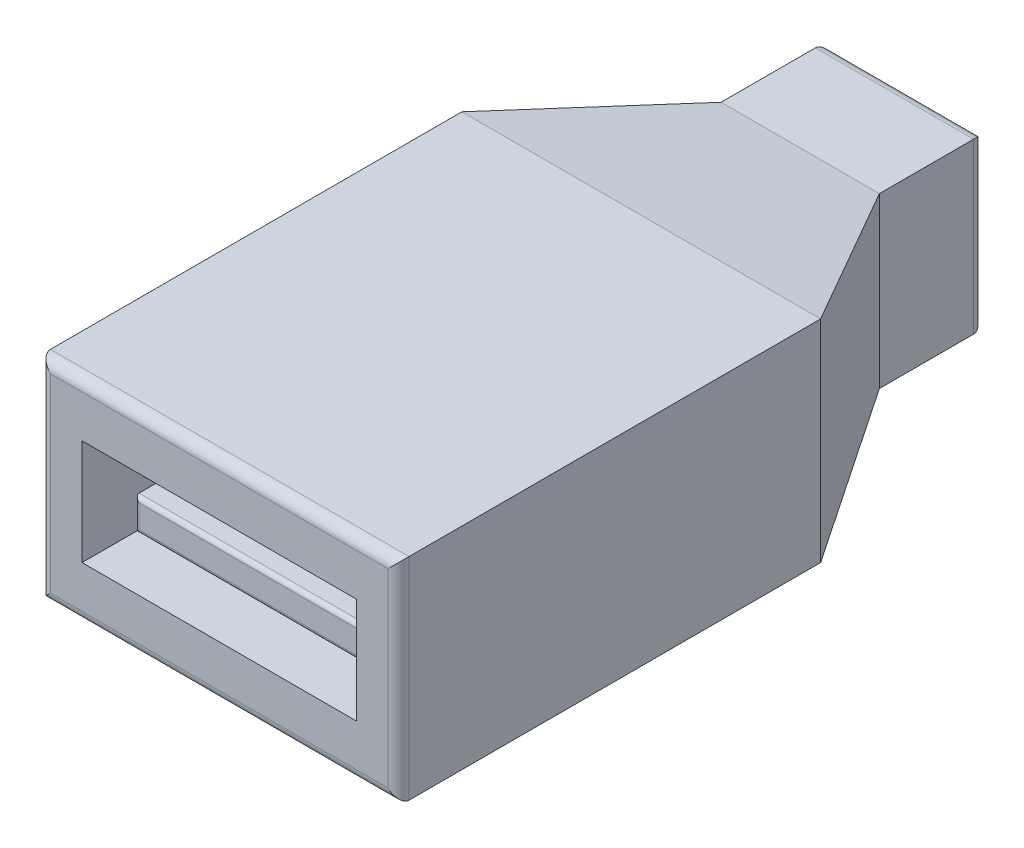
ISO-10303-21;
HEADER;
FILE_DESCRIPTION(('STEP AP214'),'2;1');
FILE_NAME('part.step','',(''),(''),'','','');
FILE_SCHEMA(('AUTOMOTIVE_DESIGN { 1 0 10303 214 1 1 1 1 }'));
ENDSEC;
DATA;
#1=APPLICATION_CONTEXT('core data for automotive mechanical design processes');
#2=APPLICATION_PROTOCOL_DEFINITION('international standard','automotive_design',2000,#1);
#3=PRODUCT_CONTEXT('',#1,'mechanical');
#4=PRODUCT('Part','Part','',(#3));
#5=PRODUCT_RELATED_PRODUCT_CATEGORY('part','',(#4));
#6=PRODUCT_DEFINITION_FORMATION('','',#4);
#7=PRODUCT_DEFINITION_CONTEXT('part definition',#1,'design');
#8=PRODUCT_DEFINITION('design','',#6,#7);
#9=PRODUCT_DEFINITION_SHAPE('','',#8);
#10=(LENGTH_UNIT() NAMED_UNIT(*) SI_UNIT(.MILLI.,.METRE.));
#11=(NAMED_UNIT(*) PLANE_ANGLE_UNIT() SI_UNIT($,.RADIAN.));
#12=(NAMED_UNIT(*) SI_UNIT($,.STERADIAN.) SOLID_ANGLE_UNIT());
#13=UNCERTAINTY_MEASURE_WITH_UNIT(LENGTH_MEASURE(1.E-05),#10,'distance_accuracy_value','');
#14=(GEOMETRIC_REPRESENTATION_CONTEXT(3) GLOBAL_UNCERTAINTY_ASSIGNED_CONTEXT((#13)) GLOBAL_UNIT_ASSIGNED_CONTEXT((#10,
#11,#12)) REPRESENTATION_CONTEXT('',''));
#15=CARTESIAN_POINT('',(0.,0.,0.));
#16=DIRECTION('',(0.,0.,1.));
#17=DIRECTION('',(1.,0.,0.));
#18=AXIS2_PLACEMENT_3D('',#15,#16,#17);
#19=CARTESIAN_POINT('',(0.,0.,-15.));
#20=DIRECTION('',(0.,0.,1.));
#21=DIRECTION('',(1.,0.,0.));
#22=AXIS2_PLACEMENT_3D('',#19,#20,#21);
#23=PLANE('',#22);
#24=DIRECTION('',(0.,-1.,0.));
#25=VECTOR('',#24,1.);
#26=CARTESIAN_POINT('',(-6.5,2.5,-15.));
#27=LINE('',#26,#25);
#28=CARTESIAN_POINT('',(-6.5,2.5,-15.));
#29=VERTEX_POINT('',#28);
#30=CARTESIAN_POINT('',(-6.5,-2.5,-15.));
#31=VERTEX_POINT('',#30);
#32=EDGE_CURVE('E215',#29,#31,#27,.T.);
#33=ORIENTED_EDGE('',*,*,#32,.T.);
#34=DIRECTION('',(1.,0.,0.));
#35=VECTOR('',#34,1.);
#36=CARTESIAN_POINT('',(-6.5,-2.5,-15.));
#37=LINE('',#36,#35);
#38=CARTESIAN_POINT('',(6.5,-2.5,-15.));
#39=VERTEX_POINT('',#38);
#40=EDGE_CURVE('E218',#31,#39,#37,.T.);
#41=ORIENTED_EDGE('',*,*,#40,.T.);
#42=DIRECTION('',(0.,1.,0.));
#43=VECTOR('',#42,1.);
#44=CARTESIAN_POINT('',(6.5,2.5,-15.));
#45=LINE('',#44,#43);
#46=CARTESIAN_POINT('',(6.5,2.5,-15.));
#47=VERTEX_POINT('',#46);
#48=EDGE_CURVE('E222',#39,#47,#45,.T.);
#49=ORIENTED_EDGE('',*,*,#48,.T.);
#50=DIRECTION('',(-1.,0.,0.));
#51=VECTOR('',#50,1.);
#52=CARTESIAN_POINT('',(-6.5,2.5,-15.));
#53=LINE('',#52,#51);
#54=EDGE_CURVE('E225',#47,#29,#53,.T.);
#55=ORIENTED_EDGE('',*,*,#54,.T.);
#56=EDGE_LOOP('',(#33,#41,#49,#55));
#57=FACE_BOUND('',#56,.T.);
#58=DIRECTION('',(1.,0.,0.));
#59=VECTOR('',#58,1.);
#60=CARTESIAN_POINT('',(-6.,-2.,-15.));
#61=LINE('',#60,#59);
#62=CARTESIAN_POINT('',(-6.,-2.,-15.));
#63=VERTEX_POINT('',#62);
#64=CARTESIAN_POINT('',(6.,-2.,-15.));
#65=VERTEX_POINT('',#64);
#66=EDGE_CURVE('E204',#63,#65,#61,.T.);
#67=ORIENTED_EDGE('',*,*,#66,.F.);
#68=DIRECTION('',(0.,-1.,0.));
#69=VECTOR('',#68,1.);
#70=CARTESIAN_POINT('',(-6.,-0.5,-15.));
#71=LINE('',#70,#69);
#72=CARTESIAN_POINT('',(-6.,-0.5,-15.));
#73=VERTEX_POINT('',#72);
#74=EDGE_CURVE('E188',#73,#63,#71,.T.);
#75=ORIENTED_EDGE('',*,*,#74,.F.);
#76=DIRECTION('',(-1.,0.,0.));
#77=VECTOR('',#76,1.);
#78=CARTESIAN_POINT('',(-6.,-0.5,-15.));
#79=LINE('',#78,#77);
#80=CARTESIAN_POINT('',(6.,-0.499999999999999,-15.));
#81=VERTEX_POINT('',#80);
#82=EDGE_CURVE('E194',#81,#73,#79,.T.);
#83=ORIENTED_EDGE('',*,*,#82,.F.);
#84=DIRECTION('',(0.,1.,0.));
#85=VECTOR('',#84,1.);
#86=CARTESIAN_POINT('',(6.,-0.499999999999999,-15.));
#87=LINE('',#86,#85);
#88=EDGE_CURVE('E213',#65,#81,#87,.T.);
#89=ORIENTED_EDGE('',*,*,#88,.F.);
#90=EDGE_LOOP('',(#67,#75,#83,#89));
#91=FACE_BOUND('',#90,.T.);
#92=ADVANCED_FACE('F36',(#57,#91),#23,.T.);
#93=CARTESIAN_POINT('',(-8.5,5.,0.));
#94=DIRECTION('',(0.,1.,0.));
#95=DIRECTION('',(0.,0.,1.));
#96=AXIS2_PLACEMENT_3D('',#93,#94,#95);
#97=PLANE('',#96);
#98=DIRECTION('',(0.,0.,1.));
#99=VECTOR('',#98,1.);
#100=CARTESIAN_POINT('',(-8.5,5.,0.));
#101=LINE('',#100,#99);
#102=CARTESIAN_POINT('',(-8.5,5.,-20.));
#103=VERTEX_POINT('',#102);
#104=CARTESIAN_POINT('',(-8.5,5.,-0.5));
#105=VERTEX_POINT('',#104);
#106=EDGE_CURVE('E278',#103,#105,#101,.T.);
#107=ORIENTED_EDGE('',*,*,#106,.T.);
#108=DIRECTION('',(1.,0.,0.));
#109=VECTOR('',#108,1.);
#110=CARTESIAN_POINT('',(-8.5,5.,-0.5));
#111=LINE('',#110,#109);
#112=CARTESIAN_POINT('',(8.5,5.,-0.5));
#113=VERTEX_POINT('',#112);
#114=EDGE_CURVE('E330',#105,#113,#111,.T.);
#115=ORIENTED_EDGE('',*,*,#114,.T.);
#116=DIRECTION('',(0.,0.,1.));
#117=VECTOR('',#116,1.);
#118=CARTESIAN_POINT('',(8.5,5.,0.));
#119=LINE('',#118,#117);
#120=CARTESIAN_POINT('',(8.5,5.,-20.));
#121=VERTEX_POINT('',#120);
#122=EDGE_CURVE('E273',#121,#113,#119,.T.);
#123=ORIENTED_EDGE('',*,*,#122,.F.);
#124=DIRECTION('',(1.,0.,0.));
#125=VECTOR('',#124,1.);
#126=CARTESIAN_POINT('',(-8.5,5.,-20.));
#127=LINE('',#126,#125);
#128=EDGE_CURVE('E284',#103,#121,#127,.T.);
#129=ORIENTED_EDGE('',*,*,#128,.F.);
#130=EDGE_LOOP('',(#107,#115,#123,#129));
#131=FACE_BOUND('',#130,.T.);
#132=ADVANCED_FACE('F404',(#131),#97,.T.);
#133=CARTESIAN_POINT('',(-8.5,5.,-20.));
#134=DIRECTION('',(0.,0.991303407620335,-0.13159617790921));
#135=DIRECTION('',(0.,0.13159617790921,0.991303407620335));
#136=AXIS2_PLACEMENT_3D('',#133,#134,#135);
#137=PLANE('',#136);
#138=DIRECTION('',(0.530048846088619,0.111589230755499,0.840592686346675));
#139=VECTOR('',#138,1.);
#140=CARTESIAN_POINT('',(3.7238197529221,3.99448836903623,-27.574438118286));
#141=LINE('',#140,#139);
#142=CARTESIAN_POINT('',(3.75,4.,-27.5329194462186));
#143=VERTEX_POINT('',#142);
#144=EDGE_CURVE('E256',#143,#121,#141,.T.);
#145=ORIENTED_EDGE('',*,*,#144,.F.);
#146=DIRECTION('',(1.,0.,0.));
#147=VECTOR('',#146,1.);
#148=CARTESIAN_POINT('',(-8.5,4.,-27.5329194462186));
#149=LINE('',#148,#147);
#150=CARTESIAN_POINT('',(-3.75,4.,-27.5329194462186));
#151=VERTEX_POINT('',#150);
#152=EDGE_CURVE('E288',#151,#143,#149,.T.);
#153=ORIENTED_EDGE('',*,*,#152,.F.);
#154=DIRECTION('',(0.530048846088619,-0.111589230755499,-0.840592686346675));
#155=VECTOR('',#154,1.);
#156=CARTESIAN_POINT('',(-8.5,5.,-20.));
#157=LINE('',#156,#155);
#158=EDGE_CURVE('E268',#103,#151,#157,.T.);
#159=ORIENTED_EDGE('',*,*,#158,.F.);
#160=ORIENTED_EDGE('',*,*,#128,.T.);
#161=EDGE_LOOP('',(#145,#153,#159,#160));
#162=FACE_BOUND('',#161,.T.);
#163=ADVANCED_FACE('F409',(#162),#137,.T.);
#164=CARTESIAN_POINT('',(-8.5,4.,-27.5329194462186));
#165=DIRECTION('',(0.,1.,0.));
#166=DIRECTION('',(0.,0.,1.));
#167=AXIS2_PLACEMENT_3D('',#164,#165,#166);
#168=PLANE('',#167);
#169=DIRECTION('',(0.,0.,1.));
#170=VECTOR('',#169,1.);
#171=CARTESIAN_POINT('',(3.75,4.,-27.5329194462186));
#172=LINE('',#171,#170);
#173=CARTESIAN_POINT('',(3.75,4.,-32.));
#174=VERTEX_POINT('',#173);
#175=EDGE_CURVE('E258',#174,#143,#172,.T.);
#176=ORIENTED_EDGE('',*,*,#175,.F.);
#177=DIRECTION('',(1.,0.,0.));
#178=VECTOR('',#177,1.);
#179=CARTESIAN_POINT('',(-8.5,4.,-32.));
#180=LINE('',#179,#178);
#181=CARTESIAN_POINT('',(-3.75,4.,-32.));
#182=VERTEX_POINT('',#181);
#183=EDGE_CURVE('E309',#174,#182,#180,.F.);
#184=ORIENTED_EDGE('',*,*,#183,.T.);
#185=DIRECTION('',(0.,0.,-1.));
#186=VECTOR('',#185,1.);
#187=CARTESIAN_POINT('',(-3.75,4.,-27.5329194462186));
#188=LINE('',#187,#186);
#189=EDGE_CURVE('E270',#151,#182,#188,.T.);
#190=ORIENTED_EDGE('',*,*,#189,.F.);
#191=ORIENTED_EDGE('',*,*,#152,.T.);
#192=EDGE_LOOP('',(#176,#184,#190,#191));
#193=FACE_BOUND('',#192,.T.);
#194=ADVANCED_FACE('F458',(#193),#168,.T.);
#195=CARTESIAN_POINT('',(-8.5,4.,-32.5));
#196=DIRECTION('',(0.,0.,-1.));
#197=DIRECTION('',(-1.,0.,0.));
#198=AXIS2_PLACEMENT_3D('',#195,#196,#197);
#199=PLANE('',#198);
#200=DIRECTION('',(0.,1.,0.));
#201=VECTOR('',#200,1.);
#202=CARTESIAN_POINT('',(-3.25,4.,-32.5));
#203=LINE('',#202,#201);
#204=CARTESIAN_POINT('',(-3.25,-3.5,-32.5));
#205=VERTEX_POINT('',#204);
#206=CARTESIAN_POINT('',(-3.25,3.5,-32.5));
#207=VERTEX_POINT('',#206);
#208=EDGE_CURVE('E304',#205,#207,#203,.T.);
#209=ORIENTED_EDGE('',*,*,#208,.T.);
#210=DIRECTION('',(1.,0.,0.));
#211=VECTOR('',#210,1.);
#212=CARTESIAN_POINT('',(-8.5,3.5,-32.5));
#213=LINE('',#212,#211);
#214=CARTESIAN_POINT('',(3.25,3.5,-32.5));
#215=VERTEX_POINT('',#214);
#216=EDGE_CURVE('E306',#207,#215,#213,.T.);
#217=ORIENTED_EDGE('',*,*,#216,.T.);
#218=DIRECTION('',(0.,1.,0.));
#219=VECTOR('',#218,1.);
#220=CARTESIAN_POINT('',(3.25,-4.,-32.5));
#221=LINE('',#220,#219);
#222=CARTESIAN_POINT('',(3.25,-3.5,-32.5));
#223=VERTEX_POINT('',#222);
#224=EDGE_CURVE('E300',#215,#223,#221,.F.);
#225=ORIENTED_EDGE('',*,*,#224,.T.);
#226=DIRECTION('',(1.,0.,0.));
#227=VECTOR('',#226,1.);
#228=CARTESIAN_POINT('',(-8.5,-3.5,-32.5));
#229=LINE('',#228,#227);
#230=EDGE_CURVE('E302',#223,#205,#229,.F.);
#231=ORIENTED_EDGE('',*,*,#230,.T.);
#232=EDGE_LOOP('',(#209,#217,#225,#231));
#233=FACE_BOUND('',#232,.T.);
#234=ADVANCED_FACE('F462',(#233),#199,.T.);
#235=CARTESIAN_POINT('',(-8.5,-4.,-27.5329194462186));
#236=DIRECTION('',(0.,-1.,0.));
#237=DIRECTION('',(0.,0.,-1.));
#238=AXIS2_PLACEMENT_3D('',#235,#236,#237);
#239=PLANE('',#238);
#240=DIRECTION('',(0.,0.,1.));
#241=VECTOR('',#240,1.);
#242=CARTESIAN_POINT('',(-3.75,-4.,-27.5329194462186));
#243=LINE('',#242,#241);
#244=CARTESIAN_POINT('',(-3.75,-4.,-32.));
#245=VERTEX_POINT('',#244);
#246=CARTESIAN_POINT('',(-3.75,-4.,-27.5329194462186));
#247=VERTEX_POINT('',#246);
#248=EDGE_CURVE('E287',#245,#247,#243,.T.);
#249=ORIENTED_EDGE('',*,*,#248,.F.);
#250=DIRECTION('',(1.,0.,0.));
#251=VECTOR('',#250,1.);
#252=CARTESIAN_POINT('',(-8.5,-4.,-32.));
#253=LINE('',#252,#251);
#254=CARTESIAN_POINT('',(3.75,-4.,-32.));
#255=VERTEX_POINT('',#254);
#256=EDGE_CURVE('E314',#245,#255,#253,.T.);
#257=ORIENTED_EDGE('',*,*,#256,.T.);
#258=DIRECTION('',(0.,0.,-1.));
#259=VECTOR('',#258,1.);
#260=CARTESIAN_POINT('',(3.75,-4.,-27.5329194462186));
#261=LINE('',#260,#259);
#262=CARTESIAN_POINT('',(3.75,-4.,-27.5329194462186));
#263=VERTEX_POINT('',#262);
#264=EDGE_CURVE('E297',#263,#255,#261,.T.);
#265=ORIENTED_EDGE('',*,*,#264,.F.);
#266=DIRECTION('',(1.,0.,0.));
#267=VECTOR('',#266,1.);
#268=CARTESIAN_POINT('',(-8.5,-4.,-27.5329194462186));
#269=LINE('',#268,#267);
#270=EDGE_CURVE('E291',#247,#263,#269,.T.);
#271=ORIENTED_EDGE('',*,*,#270,.F.);
#272=EDGE_LOOP('',(#249,#257,#265,#271));
#273=FACE_BOUND('',#272,.T.);
#274=ADVANCED_FACE('F466',(#273),#239,.T.);
#275=CARTESIAN_POINT('',(-8.5,-5.,-20.));
#276=DIRECTION('',(0.,-0.991303407620335,-0.13159617790921));
#277=DIRECTION('',(0.,0.13159617790921,-0.991303407620335));
#278=AXIS2_PLACEMENT_3D('',#275,#276,#277);
#279=PLANE('',#278);
#280=DIRECTION('',(-0.530048846088619,0.111589230755499,-0.840592686346675));
#281=VECTOR('',#280,1.);
#282=CARTESIAN_POINT('',(3.7238197529221,-3.99448836903623,-27.574438118286));
#283=LINE('',#282,#281);
#284=CARTESIAN_POINT('',(8.5,-5.,-20.));
#285=VERTEX_POINT('',#284);
#286=EDGE_CURVE('E250',#285,#263,#283,.T.);
#287=ORIENTED_EDGE('',*,*,#286,.F.);
#288=DIRECTION('',(1.,0.,0.));
#289=VECTOR('',#288,1.);
#290=CARTESIAN_POINT('',(-8.5,-5.,-20.));
#291=LINE('',#290,#289);
#292=CARTESIAN_POINT('',(-8.5,-5.,-20.));
#293=VERTEX_POINT('',#292);
#294=EDGE_CURVE('E283',#293,#285,#291,.T.);
#295=ORIENTED_EDGE('',*,*,#294,.F.);
#296=DIRECTION('',(-0.530048846088619,-0.111589230755499,0.840592686346675));
#297=VECTOR('',#296,1.);
#298=CARTESIAN_POINT('',(-8.5,-5.,-20.));
#299=LINE('',#298,#297);
#300=EDGE_CURVE('E264',#247,#293,#299,.T.);
#301=ORIENTED_EDGE('',*,*,#300,.F.);
#302=ORIENTED_EDGE('',*,*,#270,.T.);
#303=EDGE_LOOP('',(#287,#295,#301,#302));
#304=FACE_BOUND('',#303,.T.);
#305=ADVANCED_FACE('F470',(#304),#279,.T.);
#306=CARTESIAN_POINT('',(-8.5,-5.,0.));
#307=DIRECTION('',(0.,-1.,0.));
#308=DIRECTION('',(0.,0.,-1.));
#309=AXIS2_PLACEMENT_3D('',#306,#307,#308);
#310=PLANE('',#309);
#311=DIRECTION('',(0.,0.,-1.));
#312=VECTOR('',#311,1.);
#313=CARTESIAN_POINT('',(8.5,-5.,0.));
#314=LINE('',#313,#312);
#315=CARTESIAN_POINT('',(8.5,-5.,-0.5));
#316=VERTEX_POINT('',#315);
#317=EDGE_CURVE('E276',#316,#285,#314,.T.);
#318=ORIENTED_EDGE('',*,*,#317,.F.);
#319=DIRECTION('',(1.,0.,0.));
#320=VECTOR('',#319,1.);
#321=CARTESIAN_POINT('',(-8.5,-5.,-0.5));
#322=LINE('',#321,#320);
#323=CARTESIAN_POINT('',(-8.5,-5.,-0.5));
#324=VERTEX_POINT('',#323);
#325=EDGE_CURVE('E334',#316,#324,#322,.F.);
#326=ORIENTED_EDGE('',*,*,#325,.T.);
#327=DIRECTION('',(0.,0.,-1.));
#328=VECTOR('',#327,1.);
#329=CARTESIAN_POINT('',(-8.5,-5.,0.));
#330=LINE('',#329,#328);
#331=EDGE_CURVE('E281',#324,#293,#330,.T.);
#332=ORIENTED_EDGE('',*,*,#331,.T.);
#333=ORIENTED_EDGE('',*,*,#294,.T.);
#334=EDGE_LOOP('',(#318,#326,#332,#333));
#335=FACE_BOUND('',#334,.T.);
#336=ADVANCED_FACE('F474',(#335),#310,.T.);
#337=CARTESIAN_POINT('',(-8.5,-5.,0.));
#338=DIRECTION('',(0.,0.,1.));
#339=DIRECTION('',(1.,0.,0.));
#340=AXIS2_PLACEMENT_3D('',#337,#338,#339);
#341=PLANE('',#340);
#342=DIRECTION('',(0.,-1.,0.));
#343=VECTOR('',#342,1.);
#344=CARTESIAN_POINT('',(-6.5,2.5,0.));
#345=LINE('',#344,#343);
#346=CARTESIAN_POINT('',(-6.5,2.5,0.));
#347=VERTEX_POINT('',#346);
#348=CARTESIAN_POINT('',(-6.5,-2.5,0.));
#349=VERTEX_POINT('',#348);
#350=EDGE_CURVE('E201',#347,#349,#345,.T.);
#351=ORIENTED_EDGE('',*,*,#350,.F.);
#352=DIRECTION('',(-1.,0.,0.));
#353=VECTOR('',#352,1.);
#354=CARTESIAN_POINT('',(-6.5,2.5,0.));
#355=LINE('',#354,#353);
#356=CARTESIAN_POINT('',(6.5,2.5,0.));
#357=VERTEX_POINT('',#356);
#358=EDGE_CURVE('E219',#357,#347,#355,.T.);
#359=ORIENTED_EDGE('',*,*,#358,.F.);
#360=DIRECTION('',(0.,1.,0.));
#361=VECTOR('',#360,1.);
#362=CARTESIAN_POINT('',(6.5,2.5,0.));
#363=LINE('',#362,#361);
#364=CARTESIAN_POINT('',(6.5,-2.5,0.));
#365=VERTEX_POINT('',#364);
#366=EDGE_CURVE('E233',#365,#357,#363,.T.);
#367=ORIENTED_EDGE('',*,*,#366,.F.);
#368=DIRECTION('',(1.,0.,0.));
#369=VECTOR('',#368,1.);
#370=CARTESIAN_POINT('',(-6.5,-2.5,0.));
#371=LINE('',#370,#369);
#372=EDGE_CURVE('E230',#349,#365,#371,.T.);
#373=ORIENTED_EDGE('',*,*,#372,.F.);
#374=EDGE_LOOP('',(#351,#359,#367,#373));
#375=FACE_BOUND('',#374,.T.);
#376=DIRECTION('',(1.,0.,0.));
#377=VECTOR('',#376,1.);
#378=CARTESIAN_POINT('',(-8.5,4.5,0.));
#379=LINE('',#378,#377);
#380=CARTESIAN_POINT('',(8.,4.5,0.));
#381=VERTEX_POINT('',#380);
#382=CARTESIAN_POINT('',(-8.,4.5,0.));
#383=VERTEX_POINT('',#382);
#384=EDGE_CURVE('E322',#381,#383,#379,.F.);
#385=ORIENTED_EDGE('',*,*,#384,.T.);
#386=DIRECTION('',(0.,-1.,0.));
#387=VECTOR('',#386,1.);
#388=CARTESIAN_POINT('',(-8.,-5.,0.));
#389=LINE('',#388,#387);
#390=CARTESIAN_POINT('',(-8.,-4.5,0.));
#391=VERTEX_POINT('',#390);
#392=EDGE_CURVE('E324',#383,#391,#389,.T.);
#393=ORIENTED_EDGE('',*,*,#392,.T.);
#394=DIRECTION('',(1.,0.,0.));
#395=VECTOR('',#394,1.);
#396=CARTESIAN_POINT('',(-8.5,-4.5,0.));
#397=LINE('',#396,#395);
#398=CARTESIAN_POINT('',(8.,-4.5,0.));
#399=VERTEX_POINT('',#398);
#400=EDGE_CURVE('E318',#391,#399,#397,.T.);
#401=ORIENTED_EDGE('',*,*,#400,.T.);
#402=DIRECTION('',(0.,-1.,0.));
#403=VECTOR('',#402,1.);
#404=CARTESIAN_POINT('',(8.,5.,0.));
#405=LINE('',#404,#403);
#406=EDGE_CURVE('E320',#399,#381,#405,.F.);
#407=ORIENTED_EDGE('',*,*,#406,.T.);
#408=EDGE_LOOP('',(#385,#393,#401,#407));
#409=FACE_BOUND('',#408,.T.);
#410=ADVANCED_FACE('F454',(#375,#409),#341,.T.);
#411=CARTESIAN_POINT('',(-8.5,0.,0.));
#412=DIRECTION('',(-1.,0.,0.));
#413=DIRECTION('',(0.,0.,1.));
#414=AXIS2_PLACEMENT_3D('',#411,#412,#413);
#415=PLANE('',#414);
#416=ORIENTED_EDGE('',*,*,#331,.F.);
#417=DIRECTION('',(0.,-1.,0.));
#418=VECTOR('',#417,1.);
#419=CARTESIAN_POINT('',(-8.5,0.,-0.5));
#420=LINE('',#419,#418);
#421=EDGE_CURVE('E327',#324,#105,#420,.F.);
#422=ORIENTED_EDGE('',*,*,#421,.T.);
#423=ORIENTED_EDGE('',*,*,#106,.F.);
#424=DIRECTION('',(0.,1.,0.));
#425=VECTOR('',#424,1.);
#426=CARTESIAN_POINT('',(-8.5,-5.,-20.));
#427=LINE('',#426,#425);
#428=EDGE_CURVE('E260',#293,#103,#427,.T.);
#429=ORIENTED_EDGE('',*,*,#428,.F.);
#430=EDGE_LOOP('',(#416,#422,#423,#429));
#431=FACE_BOUND('',#430,.T.);
#432=ADVANCED_FACE('F450',(#431),#415,.T.);
#433=CARTESIAN_POINT('',(8.5,0.,0.));
#434=DIRECTION('',(-1.,0.,0.));
#435=DIRECTION('',(0.,0.,1.));
#436=AXIS2_PLACEMENT_3D('',#433,#434,#435);
#437=PLANE('',#436);
#438=ORIENTED_EDGE('',*,*,#122,.T.);
#439=DIRECTION('',(0.,-1.,0.));
#440=VECTOR('',#439,1.);
#441=CARTESIAN_POINT('',(8.5,-5.,-0.5));
#442=LINE('',#441,#440);
#443=EDGE_CURVE('E332',#113,#316,#442,.T.);
#444=ORIENTED_EDGE('',*,*,#443,.T.);
#445=ORIENTED_EDGE('',*,*,#317,.T.);
#446=DIRECTION('',(0.,1.,0.));
#447=VECTOR('',#446,1.);
#448=CARTESIAN_POINT('',(8.5,-5.,-20.));
#449=LINE('',#448,#447);
#450=EDGE_CURVE('E247',#285,#121,#449,.T.);
#451=ORIENTED_EDGE('',*,*,#450,.T.);
#452=EDGE_LOOP('',(#438,#444,#445,#451));
#453=FACE_BOUND('',#452,.T.);
#454=ADVANCED_FACE('F443',(#453),#437,.F.);
#455=CARTESIAN_POINT('',(-3.75,-5.,-32.5));
#456=DIRECTION('',(1.,0.,0.));
#457=DIRECTION('',(0.,0.,-1.));
#458=AXIS2_PLACEMENT_3D('',#455,#456,#457);
#459=PLANE('',#458);
#460=ORIENTED_EDGE('',*,*,#189,.T.);
#461=DIRECTION('',(0.,1.,0.));
#462=VECTOR('',#461,1.);
#463=CARTESIAN_POINT('',(-3.75,-4.,-32.));
#464=LINE('',#463,#462);
#465=EDGE_CURVE('E312',#182,#245,#464,.F.);
#466=ORIENTED_EDGE('',*,*,#465,.T.);
#467=ORIENTED_EDGE('',*,*,#248,.T.);
#468=DIRECTION('',(0.,1.,0.));
#469=VECTOR('',#468,1.);
#470=CARTESIAN_POINT('',(-3.75,-5.,-27.5329194462186));
#471=LINE('',#470,#469);
#472=EDGE_CURVE('E261',#247,#151,#471,.T.);
#473=ORIENTED_EDGE('',*,*,#472,.T.);
#474=EDGE_LOOP('',(#460,#466,#467,#473));
#475=FACE_BOUND('',#474,.T.);
#476=ADVANCED_FACE('F440',(#475),#459,.F.);
#477=CARTESIAN_POINT('',(-3.75,-5.,-27.5329194462186));
#478=DIRECTION('',(0.845875672097321,0.,0.533380115259188));
#479=DIRECTION('',(0.533380115259188,0.,-0.845875672097321));
#480=AXIS2_PLACEMENT_3D('',#477,#478,#479);
#481=PLANE('',#480);
#482=ORIENTED_EDGE('',*,*,#158,.T.);
#483=ORIENTED_EDGE('',*,*,#472,.F.);
#484=ORIENTED_EDGE('',*,*,#300,.T.);
#485=ORIENTED_EDGE('',*,*,#428,.T.);
#486=EDGE_LOOP('',(#482,#483,#484,#485));
#487=FACE_BOUND('',#486,.T.);
#488=ADVANCED_FACE('F434',(#487),#481,.F.);
#489=CARTESIAN_POINT('',(3.75,-5.,-27.5329194462186));
#490=DIRECTION('',(-0.845875672097321,0.,0.533380115259188));
#491=DIRECTION('',(0.533380115259188,0.,0.845875672097321));
#492=AXIS2_PLACEMENT_3D('',#489,#490,#491);
#493=PLANE('',#492);
#494=ORIENTED_EDGE('',*,*,#144,.T.);
#495=ORIENTED_EDGE('',*,*,#450,.F.);
#496=ORIENTED_EDGE('',*,*,#286,.T.);
#497=DIRECTION('',(0.,1.,0.));
#498=VECTOR('',#497,1.);
#499=CARTESIAN_POINT('',(3.75,-5.,-27.5329194462186));
#500=LINE('',#499,#498);
#501=EDGE_CURVE('E251',#263,#143,#500,.T.);
#502=ORIENTED_EDGE('',*,*,#501,.T.);
#503=EDGE_LOOP('',(#494,#495,#496,#502));
#504=FACE_BOUND('',#503,.T.);
#505=ADVANCED_FACE('F430',(#504),#493,.F.);
#506=CARTESIAN_POINT('',(3.75,-5.,-32.5));
#507=DIRECTION('',(-1.,0.,0.));
#508=DIRECTION('',(0.,0.,1.));
#509=AXIS2_PLACEMENT_3D('',#506,#507,#508);
#510=PLANE('',#509);
#511=ORIENTED_EDGE('',*,*,#264,.T.);
#512=DIRECTION('',(0.,1.,0.));
#513=VECTOR('',#512,1.);
#514=CARTESIAN_POINT('',(3.75,4.,-32.));
#515=LINE('',#514,#513);
#516=EDGE_CURVE('E316',#255,#174,#515,.T.);
#517=ORIENTED_EDGE('',*,*,#516,.T.);
#518=ORIENTED_EDGE('',*,*,#175,.T.);
#519=ORIENTED_EDGE('',*,*,#501,.F.);
#520=EDGE_LOOP('',(#511,#517,#518,#519));
#521=FACE_BOUND('',#520,.T.);
#522=ADVANCED_FACE('F433',(#521),#510,.F.);
#523=CARTESIAN_POINT('',(-8.5,-3.5,-32.));
#524=DIRECTION('',(1.,0.,0.));
#525=DIRECTION('',(0.,0.,-1.));
#526=AXIS2_PLACEMENT_3D('',#523,#524,#525);
#527=CYLINDRICAL_SURFACE('',#526,0.5);
#528=CARTESIAN_POINT('',(3.25,-3.5,-32.));
#529=DIRECTION('',(-0.707106781186547,-0.707106781186547,0.));
#530=DIRECTION('',(0.707106781186547,-0.707106781186547,0.));
#531=AXIS2_PLACEMENT_3D('',#528,#529,#530);
#532=ELLIPSE('',#531,0.707106781186547,0.5);
#533=EDGE_CURVE('E342',#255,#223,#532,.F.);
#534=ORIENTED_EDGE('',*,*,#533,.F.);
#535=ORIENTED_EDGE('',*,*,#256,.F.);
#536=CARTESIAN_POINT('',(-3.25,-3.5,-32.));
#537=DIRECTION('',(0.707106781186547,-0.707106781186547,0.));
#538=DIRECTION('',(0.707106781186547,0.707106781186547,0.));
#539=AXIS2_PLACEMENT_3D('',#536,#537,#538);
#540=ELLIPSE('',#539,0.707106781186547,0.5);
#541=EDGE_CURVE('E254',#205,#245,#540,.F.);
#542=ORIENTED_EDGE('',*,*,#541,.F.);
#543=ORIENTED_EDGE('',*,*,#230,.F.);
#544=EDGE_LOOP('',(#534,#535,#542,#543));
#545=FACE_BOUND('',#544,.T.);
#546=ADVANCED_FACE('F438',(#545),#527,.T.);
#547=CARTESIAN_POINT('',(-3.25,4.,-32.));
#548=DIRECTION('',(0.,-1.,0.));
#549=DIRECTION('',(0.,0.,-1.));
#550=AXIS2_PLACEMENT_3D('',#547,#548,#549);
#551=CYLINDRICAL_SURFACE('',#550,0.5);
#552=ORIENTED_EDGE('',*,*,#541,.T.);
#553=ORIENTED_EDGE('',*,*,#465,.F.);
#554=CARTESIAN_POINT('',(-3.25,3.5,-32.));
#555=DIRECTION('',(-0.707106781186547,-0.707106781186547,0.));
#556=DIRECTION('',(0.707106781186547,-0.707106781186547,0.));
#557=AXIS2_PLACEMENT_3D('',#554,#555,#556);
#558=ELLIPSE('',#557,0.707106781186547,0.5);
#559=EDGE_CURVE('E339',#207,#182,#558,.F.);
#560=ORIENTED_EDGE('',*,*,#559,.F.);
#561=ORIENTED_EDGE('',*,*,#208,.F.);
#562=EDGE_LOOP('',(#552,#553,#560,#561));
#563=FACE_BOUND('',#562,.T.);
#564=ADVANCED_FACE('F490',(#563),#551,.T.);
#565=CARTESIAN_POINT('',(3.25,-5.,-32.));
#566=DIRECTION('',(0.,-1.,0.));
#567=DIRECTION('',(0.,0.,-1.));
#568=AXIS2_PLACEMENT_3D('',#565,#566,#567);
#569=CYLINDRICAL_SURFACE('',#568,0.5);
#570=ORIENTED_EDGE('',*,*,#533,.T.);
#571=ORIENTED_EDGE('',*,*,#224,.F.);
#572=CARTESIAN_POINT('',(3.25,3.5,-32.));
#573=DIRECTION('',(0.707106781186547,-0.707106781186547,0.));
#574=DIRECTION('',(-0.707106781186547,-0.707106781186547,0.));
#575=AXIS2_PLACEMENT_3D('',#572,#573,#574);
#576=ELLIPSE('',#575,0.707106781186547,0.5);
#577=EDGE_CURVE('E337',#174,#215,#576,.F.);
#578=ORIENTED_EDGE('',*,*,#577,.F.);
#579=ORIENTED_EDGE('',*,*,#516,.F.);
#580=EDGE_LOOP('',(#570,#571,#578,#579));
#581=FACE_BOUND('',#580,.T.);
#582=ADVANCED_FACE('F486',(#581),#569,.T.);
#583=CARTESIAN_POINT('',(-8.5,3.5,-32.));
#584=DIRECTION('',(1.,0.,0.));
#585=DIRECTION('',(0.,0.,-1.));
#586=AXIS2_PLACEMENT_3D('',#583,#584,#585);
#587=CYLINDRICAL_SURFACE('',#586,0.5);
#588=ORIENTED_EDGE('',*,*,#559,.T.);
#589=ORIENTED_EDGE('',*,*,#183,.F.);
#590=ORIENTED_EDGE('',*,*,#577,.T.);
#591=ORIENTED_EDGE('',*,*,#216,.F.);
#592=EDGE_LOOP('',(#588,#589,#590,#591));
#593=FACE_BOUND('',#592,.T.);
#594=ADVANCED_FACE('F482',(#593),#587,.T.);
#595=CARTESIAN_POINT('',(8.,0.,-0.5));
#596=DIRECTION('',(0.,1.,0.));
#597=DIRECTION('',(0.,0.,1.));
#598=AXIS2_PLACEMENT_3D('',#595,#596,#597);
#599=CYLINDRICAL_SURFACE('',#598,0.5);
#600=CARTESIAN_POINT('',(8.,-4.5,-0.5));
#601=DIRECTION('',(0.707106781186547,0.707106781186547,0.));
#602=DIRECTION('',(0.707106781186547,-0.707106781186547,0.));
#603=AXIS2_PLACEMENT_3D('',#600,#601,#602);
#604=ELLIPSE('',#603,0.707106781186547,0.5);
#605=EDGE_CURVE('E350',#316,#399,#604,.F.);
#606=ORIENTED_EDGE('',*,*,#605,.F.);
#607=ORIENTED_EDGE('',*,*,#443,.F.);
#608=CARTESIAN_POINT('',(8.,4.5,-0.5));
#609=DIRECTION('',(-0.707106781186547,0.707106781186547,0.));
#610=DIRECTION('',(0.707106781186547,0.707106781186547,0.));
#611=AXIS2_PLACEMENT_3D('',#608,#609,#610);
#612=ELLIPSE('',#611,0.707106781186547,0.5);
#613=EDGE_CURVE('E340',#381,#113,#612,.T.);
#614=ORIENTED_EDGE('',*,*,#613,.F.);
#615=ORIENTED_EDGE('',*,*,#406,.F.);
#616=EDGE_LOOP('',(#606,#607,#614,#615));
#617=FACE_BOUND('',#616,.T.);
#618=ADVANCED_FACE('F485',(#617),#599,.T.);
#619=CARTESIAN_POINT('',(-8.5,4.5,-0.5));
#620=DIRECTION('',(1.,0.,0.));
#621=DIRECTION('',(0.,0.,-1.));
#622=AXIS2_PLACEMENT_3D('',#619,#620,#621);
#623=CYLINDRICAL_SURFACE('',#622,0.5);
#624=ORIENTED_EDGE('',*,*,#613,.T.);
#625=ORIENTED_EDGE('',*,*,#114,.F.);
#626=CARTESIAN_POINT('',(-8.,4.5,-0.5));
#627=DIRECTION('',(0.707106781186547,0.707106781186547,0.));
#628=DIRECTION('',(0.707106781186547,-0.707106781186547,0.));
#629=AXIS2_PLACEMENT_3D('',#626,#627,#628);
#630=ELLIPSE('',#629,0.707106781186547,0.5);
#631=EDGE_CURVE('E348',#383,#105,#630,.F.);
#632=ORIENTED_EDGE('',*,*,#631,.F.);
#633=ORIENTED_EDGE('',*,*,#384,.F.);
#634=EDGE_LOOP('',(#624,#625,#632,#633));
#635=FACE_BOUND('',#634,.T.);
#636=ADVANCED_FACE('F504',(#635),#623,.T.);
#637=CARTESIAN_POINT('',(-8.5,-4.5,-0.5));
#638=DIRECTION('',(1.,0.,0.));
#639=DIRECTION('',(0.,0.,-1.));
#640=AXIS2_PLACEMENT_3D('',#637,#638,#639);
#641=CYLINDRICAL_SURFACE('',#640,0.5);
#642=ORIENTED_EDGE('',*,*,#605,.T.);
#643=ORIENTED_EDGE('',*,*,#400,.F.);
#644=CARTESIAN_POINT('',(-8.,-4.5,-0.5));
#645=DIRECTION('',(0.707106781186547,-0.707106781186547,0.));
#646=DIRECTION('',(0.707106781186547,0.707106781186547,0.));
#647=AXIS2_PLACEMENT_3D('',#644,#645,#646);
#648=ELLIPSE('',#647,0.707106781186547,0.5);
#649=EDGE_CURVE('E240',#324,#391,#648,.F.);
#650=ORIENTED_EDGE('',*,*,#649,.F.);
#651=ORIENTED_EDGE('',*,*,#325,.F.);
#652=EDGE_LOOP('',(#642,#643,#650,#651));
#653=FACE_BOUND('',#652,.T.);
#654=ADVANCED_FACE('F500',(#653),#641,.T.);
#655=CARTESIAN_POINT('',(-8.,-5.,-0.5));
#656=DIRECTION('',(0.,-1.,0.));
#657=DIRECTION('',(0.,0.,-1.));
#658=AXIS2_PLACEMENT_3D('',#655,#656,#657);
#659=CYLINDRICAL_SURFACE('',#658,0.5);
#660=ORIENTED_EDGE('',*,*,#631,.T.);
#661=ORIENTED_EDGE('',*,*,#421,.F.);
#662=ORIENTED_EDGE('',*,*,#649,.T.);
#663=ORIENTED_EDGE('',*,*,#392,.F.);
#664=EDGE_LOOP('',(#660,#661,#662,#663));
#665=FACE_BOUND('',#664,.T.);
#666=ADVANCED_FACE('F428',(#665),#659,.T.);
#667=CARTESIAN_POINT('',(-6.5,2.5,-15.));
#668=DIRECTION('',(-1.,0.,0.));
#669=DIRECTION('',(0.,0.,1.));
#670=AXIS2_PLACEMENT_3D('',#667,#668,#669);
#671=PLANE('',#670);
#672=ORIENTED_EDGE('',*,*,#350,.T.);
#673=DIRECTION('',(0.,0.,1.));
#674=VECTOR('',#673,1.);
#675=CARTESIAN_POINT('',(-6.5,-2.5,-15.));
#676=LINE('',#675,#674);
#677=EDGE_CURVE('E228',#31,#349,#676,.T.);
#678=ORIENTED_EDGE('',*,*,#677,.F.);
#679=ORIENTED_EDGE('',*,*,#32,.F.);
#680=DIRECTION('',(0.,0.,1.));
#681=VECTOR('',#680,1.);
#682=CARTESIAN_POINT('',(-6.5,2.5,-15.));
#683=LINE('',#682,#681);
#684=EDGE_CURVE('E238',#29,#347,#683,.T.);
#685=ORIENTED_EDGE('',*,*,#684,.T.);
#686=EDGE_LOOP('',(#672,#678,#679,#685));
#687=FACE_BOUND('',#686,.T.);
#688=ADVANCED_FACE('F417',(#687),#671,.F.);
#689=CARTESIAN_POINT('',(-6.5,2.5,-15.));
#690=DIRECTION('',(0.,1.,0.));
#691=DIRECTION('',(-1.,0.,0.));
#692=AXIS2_PLACEMENT_3D('',#689,#690,#691);
#693=PLANE('',#692);
#694=ORIENTED_EDGE('',*,*,#358,.T.);
#695=ORIENTED_EDGE('',*,*,#684,.F.);
#696=ORIENTED_EDGE('',*,*,#54,.F.);
#697=DIRECTION('',(0.,0.,1.));
#698=VECTOR('',#697,1.);
#699=CARTESIAN_POINT('',(6.5,2.5,-15.));
#700=LINE('',#699,#698);
#701=EDGE_CURVE('E241',#47,#357,#700,.T.);
#702=ORIENTED_EDGE('',*,*,#701,.T.);
#703=EDGE_LOOP('',(#694,#695,#696,#702));
#704=FACE_BOUND('',#703,.T.);
#705=ADVANCED_FACE('F413',(#704),#693,.F.);
#706=CARTESIAN_POINT('',(6.5,2.5,-15.));
#707=DIRECTION('',(1.,0.,0.));
#708=DIRECTION('',(0.,0.,-1.));
#709=AXIS2_PLACEMENT_3D('',#706,#707,#708);
#710=PLANE('',#709);
#711=ORIENTED_EDGE('',*,*,#366,.T.);
#712=ORIENTED_EDGE('',*,*,#701,.F.);
#713=ORIENTED_EDGE('',*,*,#48,.F.);
#714=DIRECTION('',(0.,0.,1.));
#715=VECTOR('',#714,1.);
#716=CARTESIAN_POINT('',(6.5,-2.5,-15.));
#717=LINE('',#716,#715);
#718=EDGE_CURVE('E243',#39,#365,#717,.T.);
#719=ORIENTED_EDGE('',*,*,#718,.T.);
#720=EDGE_LOOP('',(#711,#712,#713,#719));
#721=FACE_BOUND('',#720,.T.);
#722=ADVANCED_FACE('F416',(#721),#710,.F.);
#723=CARTESIAN_POINT('',(-6.5,-2.5,-15.));
#724=DIRECTION('',(0.,-1.,0.));
#725=DIRECTION('',(1.,0.,0.));
#726=AXIS2_PLACEMENT_3D('',#723,#724,#725);
#727=PLANE('',#726);
#728=ORIENTED_EDGE('',*,*,#372,.T.);
#729=ORIENTED_EDGE('',*,*,#718,.F.);
#730=ORIENTED_EDGE('',*,*,#40,.F.);
#731=ORIENTED_EDGE('',*,*,#677,.T.);
#732=EDGE_LOOP('',(#728,#729,#730,#731));
#733=FACE_BOUND('',#732,.T.);
#734=ADVANCED_FACE('F421',(#733),#727,.F.);
#735=CARTESIAN_POINT('',(-6.,-0.5,12.0933866224478));
#736=DIRECTION('',(1.,0.,0.));
#737=DIRECTION('',(0.,0.,-1.));
#738=AXIS2_PLACEMENT_3D('',#735,#736,#737);
#739=PLANE('',#738);
#740=DIRECTION('',(0.,0.,-1.));
#741=VECTOR('',#740,1.);
#742=CARTESIAN_POINT('',(-6.,-2.,12.0933866224478));
#743=LINE('',#742,#741);
#744=CARTESIAN_POINT('',(-6.,-2.,-2.2));
#745=VERTEX_POINT('',#744);
#746=EDGE_CURVE('E205',#745,#63,#743,.T.);
#747=ORIENTED_EDGE('',*,*,#746,.F.);
#748=DIRECTION('',(0.,-1.,0.));
#749=VECTOR('',#748,1.);
#750=CARTESIAN_POINT('',(-6.,-0.5,-2.2));
#751=LINE('',#750,#749);
#752=CARTESIAN_POINT('',(-6.,-0.5,-2.2));
#753=VERTEX_POINT('',#752);
#754=EDGE_CURVE('E45',#745,#753,#751,.F.);
#755=ORIENTED_EDGE('',*,*,#754,.T.);
#756=DIRECTION('',(0.,0.,-1.));
#757=VECTOR('',#756,1.);
#758=CARTESIAN_POINT('',(-6.,-0.5,12.0933866224478));
#759=LINE('',#758,#757);
#760=EDGE_CURVE('E184',#753,#73,#759,.T.);
#761=ORIENTED_EDGE('',*,*,#760,.T.);
#762=ORIENTED_EDGE('',*,*,#74,.T.);
#763=EDGE_LOOP('',(#747,#755,#761,#762));
#764=FACE_BOUND('',#763,.T.);
#765=ADVANCED_FACE('F186',(#764),#739,.F.);
#766=CARTESIAN_POINT('',(-6.,-2.,12.0933866224478));
#767=DIRECTION('',(0.,1.,0.));
#768=DIRECTION('',(-1.,0.,0.));
#769=AXIS2_PLACEMENT_3D('',#766,#767,#768);
#770=PLANE('',#769);
#771=DIRECTION('',(0.,0.,-1.));
#772=VECTOR('',#771,1.);
#773=CARTESIAN_POINT('',(6.,-2.,12.0933866224478));
#774=LINE('',#773,#772);
#775=CARTESIAN_POINT('',(6.,-2.,-2.2));
#776=VERTEX_POINT('',#775);
#777=EDGE_CURVE('E211',#776,#65,#774,.T.);
#778=ORIENTED_EDGE('',*,*,#777,.F.);
#779=DIRECTION('',(1.,0.,0.));
#780=VECTOR('',#779,1.);
#781=CARTESIAN_POINT('',(-6.,-2.,-2.2));
#782=LINE('',#781,#780);
#783=EDGE_CURVE('E60',#776,#745,#782,.F.);
#784=ORIENTED_EDGE('',*,*,#783,.T.);
#785=ORIENTED_EDGE('',*,*,#746,.T.);
#786=ORIENTED_EDGE('',*,*,#66,.T.);
#787=EDGE_LOOP('',(#778,#784,#785,#786));
#788=FACE_BOUND('',#787,.T.);
#789=ADVANCED_FACE('F555',(#788),#770,.F.);
#790=CARTESIAN_POINT('',(6.,-0.499999999999999,12.0933866224478));
#791=DIRECTION('',(-1.,0.,0.));
#792=DIRECTION('',(0.,-1.,0.));
#793=AXIS2_PLACEMENT_3D('',#790,#791,#792);
#794=PLANE('',#793);
#795=DIRECTION('',(0.,0.,-1.));
#796=VECTOR('',#795,1.);
#797=CARTESIAN_POINT('',(6.,-0.499999999999999,12.0933866224478));
#798=LINE('',#797,#796);
#799=CARTESIAN_POINT('',(6.,-0.499999999999999,-2.2));
#800=VERTEX_POINT('',#799);
#801=EDGE_CURVE('E197',#800,#81,#798,.T.);
#802=ORIENTED_EDGE('',*,*,#801,.F.);
#803=DIRECTION('',(0.,1.,0.));
#804=VECTOR('',#803,1.);
#805=CARTESIAN_POINT('',(6.,-2.,-2.2));
#806=LINE('',#805,#804);
#807=EDGE_CURVE('E363',#800,#776,#806,.F.);
#808=ORIENTED_EDGE('',*,*,#807,.T.);
#809=ORIENTED_EDGE('',*,*,#777,.T.);
#810=ORIENTED_EDGE('',*,*,#88,.T.);
#811=EDGE_LOOP('',(#802,#808,#809,#810));
#812=FACE_BOUND('',#811,.T.);
#813=ADVANCED_FACE('F388',(#812),#794,.F.);
#814=CARTESIAN_POINT('',(-6.,-0.5,12.0933866224478));
#815=DIRECTION('',(0.,-1.,0.));
#816=DIRECTION('',(1.,0.,0.));
#817=AXIS2_PLACEMENT_3D('',#814,#815,#816);
#818=PLANE('',#817);
#819=ORIENTED_EDGE('',*,*,#760,.F.);
#820=DIRECTION('',(-1.,0.,0.));
#821=VECTOR('',#820,1.);
#822=CARTESIAN_POINT('',(6.,-0.499999999999999,-2.2));
#823=LINE('',#822,#821);
#824=EDGE_CURVE('E12',#753,#800,#823,.F.);
#825=ORIENTED_EDGE('',*,*,#824,.T.);
#826=ORIENTED_EDGE('',*,*,#801,.T.);
#827=ORIENTED_EDGE('',*,*,#82,.T.);
#828=EDGE_LOOP('',(#819,#825,#826,#827));
#829=FACE_BOUND('',#828,.T.);
#830=ADVANCED_FACE('F195',(#829),#818,.F.);
#831=CARTESIAN_POINT('',(-8.5,-5.,-2.));
#832=DIRECTION('',(0.,0.,1.));
#833=DIRECTION('',(1.,0.,0.));
#834=AXIS2_PLACEMENT_3D('',#831,#832,#833);
#835=PLANE('',#834);
#836=DIRECTION('',(1.,0.,0.));
#837=VECTOR('',#836,1.);
#838=CARTESIAN_POINT('',(6.,-1.8,-2.));
#839=LINE('',#838,#837);
#840=CARTESIAN_POINT('',(-5.8,-1.8,-2.));
#841=VERTEX_POINT('',#840);
#842=CARTESIAN_POINT('',(5.8,-1.8,-2.));
#843=VERTEX_POINT('',#842);
#844=EDGE_CURVE('E358',#841,#843,#839,.T.);
#845=ORIENTED_EDGE('',*,*,#844,.T.);
#846=DIRECTION('',(0.,1.,0.));
#847=VECTOR('',#846,1.);
#848=CARTESIAN_POINT('',(5.8,-0.499999999999999,-2.));
#849=LINE('',#848,#847);
#850=CARTESIAN_POINT('',(5.8,-0.699999999999998,-2.));
#851=VERTEX_POINT('',#850);
#852=EDGE_CURVE('E360',#843,#851,#849,.T.);
#853=ORIENTED_EDGE('',*,*,#852,.T.);
#854=DIRECTION('',(-1.,0.,0.));
#855=VECTOR('',#854,1.);
#856=CARTESIAN_POINT('',(-6.,-0.7,-2.));
#857=LINE('',#856,#855);
#858=CARTESIAN_POINT('',(-5.8,-0.7,-2.));
#859=VERTEX_POINT('',#858);
#860=EDGE_CURVE('E336',#851,#859,#857,.T.);
#861=ORIENTED_EDGE('',*,*,#860,.T.);
#862=DIRECTION('',(0.,-1.,0.));
#863=VECTOR('',#862,1.);
#864=CARTESIAN_POINT('',(-5.8,-2.,-2.));
#865=LINE('',#864,#863);
#866=EDGE_CURVE('E356',#859,#841,#865,.T.);
#867=ORIENTED_EDGE('',*,*,#866,.T.);
#868=EDGE_LOOP('',(#845,#853,#861,#867));
#869=FACE_BOUND('',#868,.T.);
#870=ADVANCED_FACE('F393',(#869),#835,.T.);
#871=CARTESIAN_POINT('',(-5.8,-5.,-2.2));
#872=DIRECTION('',(0.,1.,0.));
#873=DIRECTION('',(0.,0.,1.));
#874=AXIS2_PLACEMENT_3D('',#871,#872,#873);
#875=CYLINDRICAL_SURFACE('',#874,0.2);
#876=CARTESIAN_POINT('',(-5.8,-0.7,-2.2));
#877=DIRECTION('',(0.707106781186547,0.707106781186548,0.));
#878=DIRECTION('',(0.707106781186548,-0.707106781186547,0.));
#879=AXIS2_PLACEMENT_3D('',#876,#877,#878);
#880=ELLIPSE('',#879,0.282842712474619,0.2);
#881=EDGE_CURVE('E371',#753,#859,#880,.T.);
#882=ORIENTED_EDGE('',*,*,#881,.F.);
#883=ORIENTED_EDGE('',*,*,#754,.F.);
#884=CARTESIAN_POINT('',(-5.8,-1.8,-2.2));
#885=DIRECTION('',(-0.707106781186548,0.707106781186547,0.));
#886=DIRECTION('',(0.707106781186547,0.707106781186547,0.));
#887=AXIS2_PLACEMENT_3D('',#884,#885,#886);
#888=ELLIPSE('',#887,0.282842712474619,0.2);
#889=EDGE_CURVE('E40',#841,#745,#888,.F.);
#890=ORIENTED_EDGE('',*,*,#889,.F.);
#891=ORIENTED_EDGE('',*,*,#866,.F.);
#892=EDGE_LOOP('',(#882,#883,#890,#891));
#893=FACE_BOUND('',#892,.T.);
#894=ADVANCED_FACE('F38',(#893),#875,.T.);
#895=CARTESIAN_POINT('',(-8.5,-1.8,-2.2));
#896=DIRECTION('',(-1.,0.,0.));
#897=DIRECTION('',(0.,-1.,0.));
#898=AXIS2_PLACEMENT_3D('',#895,#896,#897);
#899=CYLINDRICAL_SURFACE('',#898,0.2);
#900=ORIENTED_EDGE('',*,*,#889,.T.);
#901=ORIENTED_EDGE('',*,*,#783,.F.);
#902=CARTESIAN_POINT('',(5.8,-1.8,-2.2));
#903=DIRECTION('',(-0.707106781186547,-0.707106781186548,0.));
#904=DIRECTION('',(-0.707106781186548,0.707106781186547,0.));
#905=AXIS2_PLACEMENT_3D('',#902,#903,#904);
#906=ELLIPSE('',#905,0.282842712474619,0.2);
#907=EDGE_CURVE('E370',#843,#776,#906,.F.);
#908=ORIENTED_EDGE('',*,*,#907,.F.);
#909=ORIENTED_EDGE('',*,*,#844,.F.);
#910=EDGE_LOOP('',(#900,#901,#908,#909));
#911=FACE_BOUND('',#910,.T.);
#912=ADVANCED_FACE('F380',(#911),#899,.T.);
#913=CARTESIAN_POINT('',(-8.5,-0.7,-2.2));
#914=DIRECTION('',(1.,0.,0.));
#915=DIRECTION('',(0.,1.,0.));
#916=AXIS2_PLACEMENT_3D('',#913,#914,#915);
#917=CYLINDRICAL_SURFACE('',#916,0.2);
#918=ORIENTED_EDGE('',*,*,#881,.T.);
#919=ORIENTED_EDGE('',*,*,#860,.F.);
#920=CARTESIAN_POINT('',(5.8,-0.699999999999998,-2.2));
#921=DIRECTION('',(0.707106781186548,-0.707106781186547,0.));
#922=DIRECTION('',(0.707106781186547,0.707106781186548,0.));
#923=AXIS2_PLACEMENT_3D('',#920,#921,#922);
#924=ELLIPSE('',#923,0.282842712474619,0.2);
#925=EDGE_CURVE('E368',#800,#851,#924,.T.);
#926=ORIENTED_EDGE('',*,*,#925,.F.);
#927=ORIENTED_EDGE('',*,*,#824,.F.);
#928=EDGE_LOOP('',(#918,#919,#926,#927));
#929=FACE_BOUND('',#928,.T.);
#930=ADVANCED_FACE('F385',(#929),#917,.T.);
#931=CARTESIAN_POINT('',(5.80000000000001,-4.99999999999998,-2.2));
#932=DIRECTION('',(0.,-1.,0.));
#933=DIRECTION('',(1.,0.,0.));
#934=AXIS2_PLACEMENT_3D('',#931,#932,#933);
#935=CYLINDRICAL_SURFACE('',#934,0.2);
#936=ORIENTED_EDGE('',*,*,#907,.T.);
#937=ORIENTED_EDGE('',*,*,#807,.F.);
#938=ORIENTED_EDGE('',*,*,#925,.T.);
#939=ORIENTED_EDGE('',*,*,#852,.F.);
#940=EDGE_LOOP('',(#936,#937,#938,#939));
#941=FACE_BOUND('',#940,.T.);
#942=ADVANCED_FACE('F390',(#941),#935,.T.);
#943=CLOSED_SHELL('',(#92,#132,#163,#194,#234,#274,#305,#336,#410,#432,#454,#476,#488,#505,#522,
#546,#564,#582,#594,#618,#636,#654,#666,#688,#705,#722,#734,#765,#789,#813,#830,#870,#894,#912,
#930,#942));
#944=MANIFOLD_SOLID_BREP('B2',#943);
#945=ADVANCED_BREP_SHAPE_REPRESENTATION('',(#18,#944),#14);
#946=SHAPE_DEFINITION_REPRESENTATION(#9,#945);
ENDSEC;
END-ISO-10303-21;
